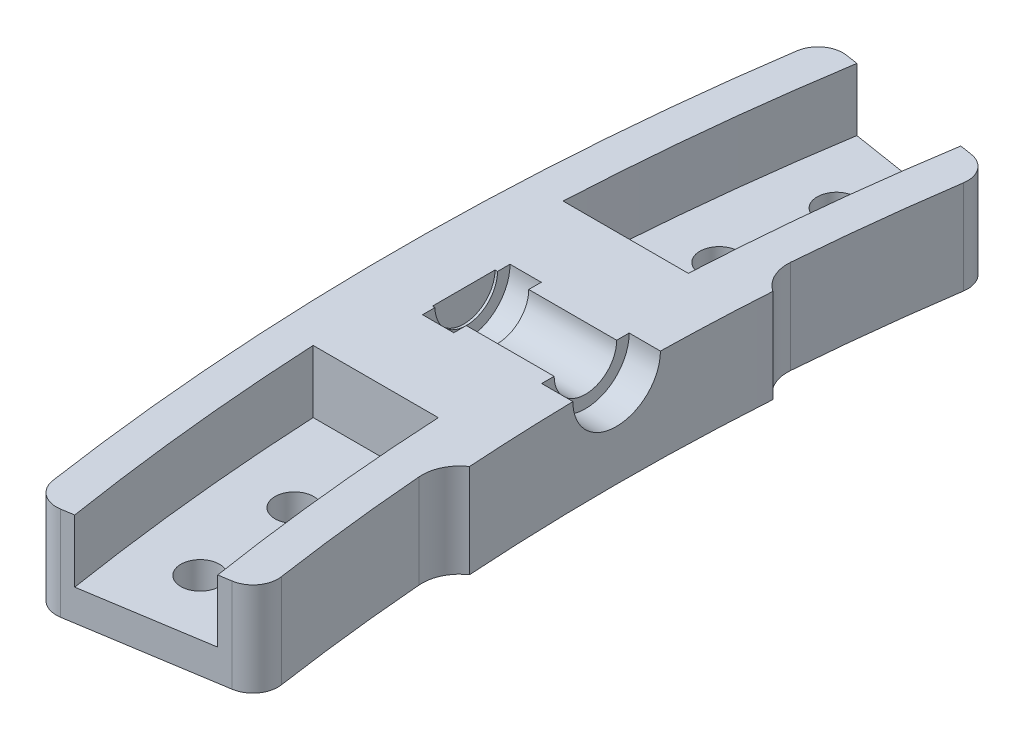
ISO-10303-21;
HEADER;
FILE_DESCRIPTION(('STEP AP214'),'2;1');
FILE_NAME('part.step','',(''),(''),'','','');
FILE_SCHEMA(('AUTOMOTIVE_DESIGN { 1 0 10303 214 1 1 1 1 }'));
ENDSEC;
DATA;
#1=APPLICATION_CONTEXT('core data for automotive mechanical design processes');
#2=APPLICATION_PROTOCOL_DEFINITION('international standard','automotive_design',2000,#1);
#3=PRODUCT_CONTEXT('',#1,'mechanical');
#4=PRODUCT('Part','Part','',(#3));
#5=PRODUCT_RELATED_PRODUCT_CATEGORY('part','',(#4));
#6=PRODUCT_DEFINITION_FORMATION('','',#4);
#7=PRODUCT_DEFINITION_CONTEXT('part definition',#1,'design');
#8=PRODUCT_DEFINITION('design','',#6,#7);
#9=PRODUCT_DEFINITION_SHAPE('','',#8);
#10=(LENGTH_UNIT() NAMED_UNIT(*) SI_UNIT(.MILLI.,.METRE.));
#11=(NAMED_UNIT(*) PLANE_ANGLE_UNIT() SI_UNIT($,.RADIAN.));
#12=(NAMED_UNIT(*) SI_UNIT($,.STERADIAN.) SOLID_ANGLE_UNIT());
#13=UNCERTAINTY_MEASURE_WITH_UNIT(LENGTH_MEASURE(1.E-05),#10,'distance_accuracy_value','');
#14=(GEOMETRIC_REPRESENTATION_CONTEXT(3) GLOBAL_UNCERTAINTY_ASSIGNED_CONTEXT((#13)) GLOBAL_UNIT_ASSIGNED_CONTEXT((#10,
#11,#12)) REPRESENTATION_CONTEXT('',''));
#15=CARTESIAN_POINT('',(0.,0.,0.));
#16=DIRECTION('',(0.,0.,1.));
#17=DIRECTION('',(1.,0.,0.));
#18=AXIS2_PLACEMENT_3D('',#15,#16,#17);
#19=CARTESIAN_POINT('',(0.,10.,0.));
#20=DIRECTION('',(0.,-1.,0.));
#21=DIRECTION('',(0.,0.,-1.));
#22=AXIS2_PLACEMENT_3D('',#19,#20,#21);
#23=CYLINDRICAL_SURFACE('',#22,185.5);
#24=CARTESIAN_POINT('',(0.,2.5,0.));
#25=DIRECTION('',(0.,1.,0.));
#26=DIRECTION('',(0.,0.,-1.));
#27=AXIS2_PLACEMENT_3D('',#24,#25,#26);
#28=CIRCLE('',#27,185.5);
#29=CARTESIAN_POINT('',(-185.102830260761,2.5,-12.1322804721913));
#30=VERTEX_POINT('',#29);
#31=CARTESIAN_POINT('',(-185.102830260761,2.5,12.1322804721918));
#32=VERTEX_POINT('',#31);
#33=EDGE_CURVE('E343',#30,#32,#28,.T.);
#34=ORIENTED_EDGE('',*,*,#33,.F.);
#35=DIRECTION('',(0.,-1.,0.));
#36=VECTOR('',#35,1.);
#37=CARTESIAN_POINT('',(-185.102830260761,10.,-12.1322804721916));
#38=LINE('',#37,#36);
#39=CARTESIAN_POINT('',(-185.102830260761,10.,-12.1322804721916));
#40=VERTEX_POINT('',#39);
#41=EDGE_CURVE('E346',#40,#30,#38,.T.);
#42=ORIENTED_EDGE('',*,*,#41,.F.);
#43=CARTESIAN_POINT('',(0.,10.,0.));
#44=DIRECTION('',(0.,-1.,0.));
#45=DIRECTION('',(0.,0.,1.));
#46=AXIS2_PLACEMENT_3D('',#43,#44,#45);
#47=CIRCLE('',#46,185.5);
#48=CARTESIAN_POINT('',(-185.466978192885,10.,-3.50000000000007));
#49=VERTEX_POINT('',#48);
#50=EDGE_CURVE('E456',#49,#40,#47,.T.);
#51=ORIENTED_EDGE('',*,*,#50,.F.);
#52=CARTESIAN_POINT('',(-185.466978192885,10.,-3.5));
#53=CARTESIAN_POINT('',(-185.466977430939,9.9015687384195,-3.50000944061988));
#54=CARTESIAN_POINT('',(-185.467056536335,9.80314196188526,-3.49584772852682));
#55=CARTESIAN_POINT('',(-185.467368855888,9.60699276190361,-3.47925506337131));
#56=CARTESIAN_POINT('',(-185.467602062565,9.50927030450143,-3.46682451167632));
#57=CARTESIAN_POINT('',(-185.468216741485,9.31528432602201,-3.43377895386925));
#58=CARTESIAN_POINT('',(-185.468598108343,9.21901981836458,-3.4131697649693));
#59=CARTESIAN_POINT('',(-185.469497617825,9.0285929662776,-3.36393426603975));
#60=CARTESIAN_POINT('',(-185.470015758806,8.93443059661094,-3.33530805231413));
#61=CARTESIAN_POINT('',(-185.471755316775,8.65600881932056,-3.23763660090778));
#62=CARTESIAN_POINT('',(-185.473162149319,8.47573195361423,-3.1567843740943));
#63=CARTESIAN_POINT('',(-185.476310472255,8.13144657686859,-2.96602237242094));
#64=CARTESIAN_POINT('',(-185.478051897782,7.96743492200356,-2.85611822798098));
#65=CARTESIAN_POINT('',(-185.481673830463,7.66013870584939,-2.61031457726576));
#66=CARTESIAN_POINT('',(-185.483554356072,7.51685690237821,-2.47441161778506));
#67=CARTESIAN_POINT('',(-185.487242545187,7.25512688017052,-2.180461789051));
#68=CARTESIAN_POINT('',(-185.489050197554,7.13668244637191,-2.02241155091273));
#69=CARTESIAN_POINT('',(-185.492388616318,6.92800421618844,-1.6886604756404));
#70=CARTESIAN_POINT('',(-185.493919374273,6.83777127989766,-1.51295910058552));
#71=CARTESIAN_POINT('',(-185.496531252063,6.68809125509204,-1.14890943189334));
#72=CARTESIAN_POINT('',(-185.497612400989,6.62864217475323,-0.960561957394306));
#73=CARTESIAN_POINT('',(-185.499203226703,6.54221396354896,-0.576576330685134));
#74=CARTESIAN_POINT('',(-185.499712960763,6.51523157863381,-0.380938911153297));
#75=CARTESIAN_POINT('',(-185.500103688222,6.4944927772822,0.0120942016270402));
#76=CARTESIAN_POINT('',(-185.499984667711,6.50073709590742,0.20948993367757));
#77=CARTESIAN_POINT('',(-185.499131332768,6.5462726740005,0.600403183315228));
#78=CARTESIAN_POINT('',(-185.498397102807,6.58555939657909,0.793921229593688));
#79=CARTESIAN_POINT('',(-185.4963962187,6.6960574896132,1.17161389756717));
#80=CARTESIAN_POINT('',(-185.495129566015,6.76726877236853,1.35578854492795));
#81=CARTESIAN_POINT('',(-185.492206448889,6.93960136811132,1.70958526125013));
#82=CARTESIAN_POINT('',(-185.490549949042,7.04072539785485,1.87920600658106));
#83=CARTESIAN_POINT('',(-185.487033980167,7.2700059386379,2.19905613244696));
#84=CARTESIAN_POINT('',(-185.485174520891,7.39816115100553,2.34928644400698));
#85=CARTESIAN_POINT('',(-185.481462067495,7.67787076446034,2.62610683719885));
#86=CARTESIAN_POINT('',(-185.479609073517,7.82942567372653,2.75269640528484));
#87=CARTESIAN_POINT('',(-185.476117893751,8.15169764500472,2.97867604968191));
#88=CARTESIAN_POINT('',(-185.474479776318,8.322420772798,3.0780574815778));
#89=CARTESIAN_POINT('',(-185.471602891485,8.67820485888656,3.24679456806401));
#90=CARTESIAN_POINT('',(-185.470364368728,8.86327451485222,3.31613183768987));
#91=CARTESIAN_POINT('',(-185.468429637325,9.24228661070111,3.42264413776416));
#92=CARTESIAN_POINT('',(-185.46773260079,9.43621502360442,3.45986827637521));
#93=CARTESIAN_POINT('',(-185.467222256108,9.69286188419213,3.48704466585143));
#94=CARTESIAN_POINT('',(-185.467130779183,9.75424289207597,3.49190547814544));
#95=CARTESIAN_POINT('',(-185.467008829149,9.87707430779331,3.49837871080356));
#96=CARTESIAN_POINT('',(-185.466978255392,9.93852443293174,3.49999649055055));
#97=CARTESIAN_POINT('',(-185.466978192885,10.,3.49999999999996));
#98=B_SPLINE_CURVE_WITH_KNOTS('',3,(#52,#53,#54,#55,#56,#57,#58,#59,#60,#61,#62,#63,#64,#65,#66,
#67,#68,#69,#70,#71,#72,#73,#74,#75,#76,#77,#78,#79,#80,#81,#82,#83,#84,#85,#86,#87,#88,#89,#90,
#91,#92,#93,#94,#95,#96,#97),.UNSPECIFIED.,.F.,.F.,(4,2,2,2,2,2,2,2,2,2,2,2,2,2,2,2,2,2,2,2,2,2,
4),(0.,0.295197718043893,0.590381108307979,0.885354918967884,1.18032518642623,1.77001690874314,
2.35959442927562,2.94925031290328,3.53899598831038,4.12875964175319,4.71848513063971,
5.30815150799942,5.89783093037718,6.48742940000166,7.07702624994617,7.66667666511138,
8.25629875787275,8.84593365745519,9.43575567567408,10.025938116493,10.6152164283205,
10.7998763838495,10.9842309209288),.UNSPECIFIED.);
#99=CARTESIAN_POINT('',(-185.466978192885,10.,3.50000000000145));
#100=VERTEX_POINT('',#99);
#101=EDGE_CURVE('E42',#49,#100,#98,.T.);
#102=ORIENTED_EDGE('',*,*,#101,.T.);
#103=CARTESIAN_POINT('',(-185.102830260761,10.,12.1322804721917));
#104=VERTEX_POINT('',#103);
#105=EDGE_CURVE('E366',#104,#100,#47,.T.);
#106=ORIENTED_EDGE('',*,*,#105,.F.);
#107=DIRECTION('',(0.,-1.,0.));
#108=VECTOR('',#107,1.);
#109=CARTESIAN_POINT('',(-185.102830260761,10.,12.1322804721917));
#110=LINE('',#109,#108);
#111=EDGE_CURVE('E350',#104,#32,#110,.T.);
#112=ORIENTED_EDGE('',*,*,#111,.T.);
#113=EDGE_LOOP('',(#34,#42,#51,#102,#106,#112));
#114=FACE_BOUND('',#113,.T.);
#115=ADVANCED_FACE('F34',(#114),#23,.F.);
#116=CARTESIAN_POINT('',(0.,10.,0.));
#117=DIRECTION('',(0.,-1.,0.));
#118=DIRECTION('',(0.,0.,-1.));
#119=AXIS2_PLACEMENT_3D('',#116,#117,#118);
#120=CYLINDRICAL_SURFACE('',#119,187.);
#121=DIRECTION('',(0.,-1.,0.));
#122=VECTOR('',#121,1.);
#123=CARTESIAN_POINT('',(-186.409178624213,10.,-14.8532193361004));
#124=LINE('',#123,#122);
#125=CARTESIAN_POINT('',(-186.409178624213,10.,-14.8532193361004));
#126=VERTEX_POINT('',#125);
#127=CARTESIAN_POINT('',(-186.409178624213,2.5,-14.8532193361002));
#128=VERTEX_POINT('',#127);
#129=EDGE_CURVE('E445',#126,#128,#124,.T.);
#130=ORIENTED_EDGE('',*,*,#129,.T.);
#131=CARTESIAN_POINT('',(0.,2.5,0.));
#132=DIRECTION('',(0.,1.,0.));
#133=DIRECTION('',(0.,0.,-1.));
#134=AXIS2_PLACEMENT_3D('',#131,#132,#133);
#135=CIRCLE('',#134,187.);
#136=CARTESIAN_POINT('',(-184.996936421358,2.5,-27.2971338186249));
#137=VERTEX_POINT('',#136);
#138=EDGE_CURVE('E458',#137,#128,#135,.T.);
#139=ORIENTED_EDGE('',*,*,#138,.F.);
#140=DIRECTION('',(0.,-1.,0.));
#141=VECTOR('',#140,1.);
#142=CARTESIAN_POINT('',(-184.996936421358,10.,-27.2971338186249));
#143=LINE('',#142,#141);
#144=CARTESIAN_POINT('',(-184.996936421358,10.,-27.2971338186249));
#145=VERTEX_POINT('',#144);
#146=EDGE_CURVE('E269',#137,#145,#143,.F.);
#147=ORIENTED_EDGE('',*,*,#146,.T.);
#148=CARTESIAN_POINT('',(0.,10.,0.));
#149=DIRECTION('',(0.,1.,0.));
#150=DIRECTION('',(0.,0.,1.));
#151=AXIS2_PLACEMENT_3D('',#148,#149,#150);
#152=CIRCLE('',#151,187.);
#153=EDGE_CURVE('E438',#145,#126,#152,.T.);
#154=ORIENTED_EDGE('',*,*,#153,.T.);
#155=EDGE_LOOP('',(#130,#139,#147,#154));
#156=FACE_BOUND('',#155,.T.);
#157=ADVANCED_FACE('F332',(#156),#120,.F.);
#158=DIRECTION('',(0.,-1.,0.));
#159=VECTOR('',#158,1.);
#160=CARTESIAN_POINT('',(-184.996936421358,10.,27.2971338186247));
#161=LINE('',#160,#159);
#162=CARTESIAN_POINT('',(-184.996936421358,10.,27.2971338186247));
#163=VERTEX_POINT('',#162);
#164=CARTESIAN_POINT('',(-184.996936421358,2.5,27.2971338186247));
#165=VERTEX_POINT('',#164);
#166=EDGE_CURVE('E266',#163,#165,#161,.T.);
#167=ORIENTED_EDGE('',*,*,#166,.T.);
#168=CARTESIAN_POINT('',(0.,2.5,0.));
#169=DIRECTION('',(0.,1.,0.));
#170=DIRECTION('',(0.,0.,-1.));
#171=AXIS2_PLACEMENT_3D('',#168,#169,#170);
#172=CIRCLE('',#171,187.);
#173=CARTESIAN_POINT('',(-186.409178624213,2.5,14.8532193361011));
#174=VERTEX_POINT('',#173);
#175=EDGE_CURVE('E493',#174,#165,#172,.T.);
#176=ORIENTED_EDGE('',*,*,#175,.F.);
#177=DIRECTION('',(0.,-1.,0.));
#178=VECTOR('',#177,1.);
#179=CARTESIAN_POINT('',(-186.409178624213,10.,14.8532193361011));
#180=LINE('',#179,#178);
#181=CARTESIAN_POINT('',(-186.409178624213,10.,14.8532193361011));
#182=VERTEX_POINT('',#181);
#183=EDGE_CURVE('E449',#174,#182,#180,.F.);
#184=ORIENTED_EDGE('',*,*,#183,.T.);
#185=EDGE_CURVE('E437',#182,#163,#152,.T.);
#186=ORIENTED_EDGE('',*,*,#185,.T.);
#187=EDGE_LOOP('',(#167,#176,#184,#186));
#188=FACE_BOUND('',#187,.T.);
#189=ADVANCED_FACE('F337',(#188),#120,.F.);
#190=CARTESIAN_POINT('',(0.,10.,0.));
#191=DIRECTION('',(0.156434465040231,0.,0.987688340595138));
#192=DIRECTION('',(0.987688340595138,0.,-0.156434465040231));
#193=AXIS2_PLACEMENT_3D('',#190,#191,#192);
#194=PLANE('',#193);
#195=DIRECTION('',(0.,1.,0.));
#196=VECTOR('',#195,1.);
#197=CARTESIAN_POINT('',(-198.515528471673,0.,31.4417708727156));
#198=LINE('',#197,#196);
#199=CARTESIAN_POINT('',(-198.515528471673,10.,31.4417708727156));
#200=VERTEX_POINT('',#199);
#201=CARTESIAN_POINT('',(-198.515528471673,2.5,31.4417708727156));
#202=VERTEX_POINT('',#201);
#203=EDGE_CURVE('E264',#200,#202,#198,.F.);
#204=ORIENTED_EDGE('',*,*,#203,.T.);
#205=DIRECTION('',(-0.987688340595138,0.,0.156434465040229));
#206=VECTOR('',#205,1.);
#207=CARTESIAN_POINT('',(-186.662644351399,2.5,29.5644584550945));
#208=LINE('',#207,#206);
#209=CARTESIAN_POINT('',(-186.662644351399,2.5,29.5644584550945));
#210=VERTEX_POINT('',#209);
#211=EDGE_CURVE('E224',#210,#202,#208,.T.);
#212=ORIENTED_EDGE('',*,*,#211,.F.);
#213=DIRECTION('',(0.,-1.,0.));
#214=VECTOR('',#213,1.);
#215=CARTESIAN_POINT('',(-186.662644351399,10.,29.5644584550944));
#216=LINE('',#215,#214);
#217=CARTESIAN_POINT('',(-186.662644351399,10.,29.5644584550944));
#218=VERTEX_POINT('',#217);
#219=EDGE_CURVE('E262',#210,#218,#216,.F.);
#220=ORIENTED_EDGE('',*,*,#219,.T.);
#221=DIRECTION('',(-0.987688340595138,0.,0.156434465040231));
#222=VECTOR('',#221,1.);
#223=CARTESIAN_POINT('',(0.,10.,0.));
#224=LINE('',#223,#222);
#225=CARTESIAN_POINT('',(-187.660784713076,10.,29.7225483576439));
#226=VERTEX_POINT('',#225);
#227=EDGE_CURVE('E435',#218,#226,#224,.T.);
#228=ORIENTED_EDGE('',*,*,#227,.T.);
#229=DIRECTION('',(0.,1.,0.));
#230=VECTOR('',#229,1.);
#231=CARTESIAN_POINT('',(-187.660784713076,5.,29.7225483576439));
#232=LINE('',#231,#230);
#233=CARTESIAN_POINT('',(-187.660784713076,5.,29.7225483576439));
#234=VERTEX_POINT('',#233);
#235=EDGE_CURVE('E427',#234,#226,#232,.T.);
#236=ORIENTED_EDGE('',*,*,#235,.F.);
#237=DIRECTION('',(0.987688340595138,0.,-0.156434465040231));
#238=VECTOR('',#237,1.);
#239=CARTESIAN_POINT('',(0.,5.,0.));
#240=LINE('',#239,#238);
#241=CARTESIAN_POINT('',(-197.537668119028,5.,31.2868930080463));
#242=VERTEX_POINT('',#241);
#243=EDGE_CURVE('E415',#242,#234,#240,.T.);
#244=ORIENTED_EDGE('',*,*,#243,.F.);
#245=DIRECTION('',(0.,1.,0.));
#246=VECTOR('',#245,1.);
#247=CARTESIAN_POINT('',(-197.537668119028,5.,31.2868930080463));
#248=LINE('',#247,#246);
#249=CARTESIAN_POINT('',(-197.537668119028,10.,31.2868930080463));
#250=VERTEX_POINT('',#249);
#251=EDGE_CURVE('E430',#242,#250,#248,.T.);
#252=ORIENTED_EDGE('',*,*,#251,.T.);
#253=EDGE_CURVE('E401',#250,#200,#224,.T.);
#254=ORIENTED_EDGE('',*,*,#253,.T.);
#255=EDGE_LOOP('',(#204,#212,#220,#228,#236,#244,#252,#254));
#256=FACE_BOUND('',#255,.T.);
#257=ADVANCED_FACE('F564',(#256),#194,.T.);
#258=CARTESIAN_POINT('',(0.,10.,0.));
#259=DIRECTION('',(0.156434465040232,0.,-0.987688340595138));
#260=DIRECTION('',(-0.987688340595138,0.,-0.156434465040232));
#261=AXIS2_PLACEMENT_3D('',#258,#259,#260);
#262=PLANE('',#261);
#263=DIRECTION('',(0.,-1.,0.));
#264=VECTOR('',#263,1.);
#265=CARTESIAN_POINT('',(-186.662644351399,10.,-29.5644584550946));
#266=LINE('',#265,#264);
#267=CARTESIAN_POINT('',(-186.662644351399,10.,-29.5644584550946));
#268=VERTEX_POINT('',#267);
#269=CARTESIAN_POINT('',(-186.662644351399,2.5,-29.5644584550946));
#270=VERTEX_POINT('',#269);
#271=EDGE_CURVE('E245',#268,#270,#266,.T.);
#272=ORIENTED_EDGE('',*,*,#271,.T.);
#273=DIRECTION('',(0.987688340595138,0.,0.156434465040231));
#274=VECTOR('',#273,1.);
#275=CARTESIAN_POINT('',(-198.515528471673,2.5,-31.4417708727157));
#276=LINE('',#275,#274);
#277=CARTESIAN_POINT('',(-198.515528471673,2.5,-31.4417708727157));
#278=VERTEX_POINT('',#277);
#279=EDGE_CURVE('E49',#278,#270,#276,.T.);
#280=ORIENTED_EDGE('',*,*,#279,.F.);
#281=DIRECTION('',(0.,1.,0.));
#282=VECTOR('',#281,1.);
#283=CARTESIAN_POINT('',(-198.515528471673,10.,-31.4417708727157));
#284=LINE('',#283,#282);
#285=CARTESIAN_POINT('',(-198.515528471673,10.,-31.4417708727157));
#286=VERTEX_POINT('',#285);
#287=EDGE_CURVE('E253',#278,#286,#284,.T.);
#288=ORIENTED_EDGE('',*,*,#287,.T.);
#289=DIRECTION('',(0.987688340595138,0.,0.156434465040232));
#290=VECTOR('',#289,1.);
#291=CARTESIAN_POINT('',(0.,10.,0.));
#292=LINE('',#291,#290);
#293=CARTESIAN_POINT('',(-197.537668119028,10.,-31.2868930080464));
#294=VERTEX_POINT('',#293);
#295=EDGE_CURVE('E441',#286,#294,#292,.T.);
#296=ORIENTED_EDGE('',*,*,#295,.T.);
#297=DIRECTION('',(0.,1.,0.));
#298=VECTOR('',#297,1.);
#299=CARTESIAN_POINT('',(-197.537668119028,5.,-31.2868930080464));
#300=LINE('',#299,#298);
#301=CARTESIAN_POINT('',(-197.537668119028,5.,-31.2868930080464));
#302=VERTEX_POINT('',#301);
#303=EDGE_CURVE('E388',#302,#294,#300,.T.);
#304=ORIENTED_EDGE('',*,*,#303,.F.);
#305=DIRECTION('',(-0.987688340595138,0.,-0.156434465040232));
#306=VECTOR('',#305,1.);
#307=CARTESIAN_POINT('',(0.,5.,0.));
#308=LINE('',#307,#306);
#309=CARTESIAN_POINT('',(-187.660784713076,5.,-29.7225483576441));
#310=VERTEX_POINT('',#309);
#311=EDGE_CURVE('E377',#310,#302,#308,.T.);
#312=ORIENTED_EDGE('',*,*,#311,.F.);
#313=DIRECTION('',(0.,1.,0.));
#314=VECTOR('',#313,1.);
#315=CARTESIAN_POINT('',(-187.660784713076,5.,-29.7225483576441));
#316=LINE('',#315,#314);
#317=CARTESIAN_POINT('',(-187.660784713076,10.,-29.7225483576441));
#318=VERTEX_POINT('',#317);
#319=EDGE_CURVE('E398',#310,#318,#316,.T.);
#320=ORIENTED_EDGE('',*,*,#319,.T.);
#321=EDGE_CURVE('E440',#318,#268,#292,.T.);
#322=ORIENTED_EDGE('',*,*,#321,.T.);
#323=EDGE_LOOP('',(#272,#280,#288,#296,#304,#312,#320,#322));
#324=FACE_BOUND('',#323,.T.);
#325=ADVANCED_FACE('F466',(#324),#262,.T.);
#326=CARTESIAN_POINT('',(0.,10.,0.));
#327=DIRECTION('',(0.,-1.,0.));
#328=DIRECTION('',(0.,0.,-1.));
#329=AXIS2_PLACEMENT_3D('',#326,#327,#328);
#330=CYLINDRICAL_SURFACE('',#329,203.);
#331=CARTESIAN_POINT('',(0.,2.5,0.));
#332=DIRECTION('',(0.,-1.,0.));
#333=DIRECTION('',(0.,0.,-1.));
#334=AXIS2_PLACEMENT_3D('',#331,#332,#333);
#335=CIRCLE('',#334,203.);
#336=CARTESIAN_POINT('',(-200.806789415701,2.5,29.7595921436799));
#337=VERTEX_POINT('',#336);
#338=CARTESIAN_POINT('',(-200.806789415701,2.5,-29.7595921436798));
#339=VERTEX_POINT('',#338);
#340=EDGE_CURVE('E221',#337,#339,#335,.T.);
#341=ORIENTED_EDGE('',*,*,#340,.F.);
#342=DIRECTION('',(0.,-1.,0.));
#343=VECTOR('',#342,1.);
#344=CARTESIAN_POINT('',(-200.806789415701,10.,29.7595921436798));
#345=LINE('',#344,#343);
#346=CARTESIAN_POINT('',(-200.806789415701,10.,29.7595921436798));
#347=VERTEX_POINT('',#346);
#348=EDGE_CURVE('E234',#337,#347,#345,.F.);
#349=ORIENTED_EDGE('',*,*,#348,.T.);
#350=CARTESIAN_POINT('',(0.,10.,0.));
#351=DIRECTION('',(0.,1.,0.));
#352=DIRECTION('',(0.,0.,1.));
#353=AXIS2_PLACEMENT_3D('',#350,#351,#352);
#354=CIRCLE('',#353,203.);
#355=CARTESIAN_POINT('',(-200.806789415701,10.,-29.7595921436799));
#356=VERTEX_POINT('',#355);
#357=EDGE_CURVE('E443',#356,#347,#354,.T.);
#358=ORIENTED_EDGE('',*,*,#357,.F.);
#359=DIRECTION('',(0.,-1.,0.));
#360=VECTOR('',#359,1.);
#361=CARTESIAN_POINT('',(-200.806789415701,10.,-29.7595921436799));
#362=LINE('',#361,#360);
#363=EDGE_CURVE('E237',#356,#339,#362,.T.);
#364=ORIENTED_EDGE('',*,*,#363,.T.);
#365=EDGE_LOOP('',(#341,#349,#358,#364));
#366=FACE_BOUND('',#365,.T.);
#367=ADVANCED_FACE('F232',(#366),#330,.T.);
#368=CARTESIAN_POINT('',(-193.331747967893,0.,-25.4526074829103));
#369=DIRECTION('',(0.,-1.,0.));
#370=DIRECTION('',(0.,0.,-1.));
#371=AXIS2_PLACEMENT_3D('',#368,#369,#370);
#372=CYLINDRICAL_SURFACE('',#371,1.55);
#373=CARTESIAN_POINT('',(-193.331747967893,5.,-25.4526074829103));
#374=DIRECTION('',(0.,1.,0.));
#375=DIRECTION('',(0.,0.,1.));
#376=AXIS2_PLACEMENT_3D('',#373,#374,#375);
#377=CIRCLE('',#376,1.55);
#378=CARTESIAN_POINT('',(-193.331747967893,5.,-23.9026074829103));
#379=VERTEX_POINT('',#378);
#380=EDGE_CURVE('E373',#379,#379,#377,.T.);
#381=ORIENTED_EDGE('',*,*,#380,.T.);
#382=EDGE_LOOP('',(#381));
#383=FACE_BOUND('',#382,.T.);
#384=CARTESIAN_POINT('',(-193.331747967893,2.5,-25.4526074829103));
#385=DIRECTION('',(0.,-1.,0.));
#386=DIRECTION('',(0.,0.,-1.));
#387=AXIS2_PLACEMENT_3D('',#384,#385,#386);
#388=CIRCLE('',#387,1.55);
#389=CARTESIAN_POINT('',(-193.331747967893,2.5,-27.0026074829102));
#390=VERTEX_POINT('',#389);
#391=EDGE_CURVE('E507',#390,#390,#388,.F.);
#392=ORIENTED_EDGE('',*,*,#391,.F.);
#393=EDGE_LOOP('',(#392));
#394=FACE_BOUND('',#393,.T.);
#395=ADVANCED_FACE('F606',(#383,#394),#372,.F.);
#396=CARTESIAN_POINT('',(-194.25796612789,0.,-16.9953698357934));
#397=DIRECTION('',(0.,-1.,0.));
#398=DIRECTION('',(0.,0.,-1.));
#399=AXIS2_PLACEMENT_3D('',#396,#397,#398);
#400=CYLINDRICAL_SURFACE('',#399,1.55);
#401=CARTESIAN_POINT('',(-194.25796612789,5.,-16.9953698357934));
#402=DIRECTION('',(0.,1.,0.));
#403=DIRECTION('',(0.,0.,1.));
#404=AXIS2_PLACEMENT_3D('',#401,#402,#403);
#405=CIRCLE('',#404,1.55);
#406=CARTESIAN_POINT('',(-194.25796612789,5.,-15.4453698357934));
#407=VERTEX_POINT('',#406);
#408=EDGE_CURVE('E372',#407,#407,#405,.T.);
#409=ORIENTED_EDGE('',*,*,#408,.T.);
#410=EDGE_LOOP('',(#409));
#411=FACE_BOUND('',#410,.T.);
#412=CARTESIAN_POINT('',(-194.25796612789,2.5,-16.9953698357934));
#413=DIRECTION('',(0.,-1.,0.));
#414=DIRECTION('',(0.,0.,-1.));
#415=AXIS2_PLACEMENT_3D('',#412,#413,#414);
#416=CIRCLE('',#415,1.55);
#417=CARTESIAN_POINT('',(-194.25796612789,2.5,-18.5453698357934));
#418=VERTEX_POINT('',#417);
#419=EDGE_CURVE('E504',#418,#418,#416,.F.);
#420=ORIENTED_EDGE('',*,*,#419,.F.);
#421=EDGE_LOOP('',(#420));
#422=FACE_BOUND('',#421,.T.);
#423=ADVANCED_FACE('F768',(#411,#422),#400,.F.);
#424=CARTESIAN_POINT('',(-194.25796612789,0.,16.9953698357934));
#425=DIRECTION('',(0.,-1.,0.));
#426=DIRECTION('',(0.,0.,-1.));
#427=AXIS2_PLACEMENT_3D('',#424,#425,#426);
#428=CYLINDRICAL_SURFACE('',#427,1.55);
#429=CARTESIAN_POINT('',(-194.25796612789,5.,16.9953698357934));
#430=DIRECTION('',(0.,1.,0.));
#431=DIRECTION('',(0.,0.,1.));
#432=AXIS2_PLACEMENT_3D('',#429,#430,#431);
#433=CIRCLE('',#432,1.55);
#434=CARTESIAN_POINT('',(-194.25796612789,5.,18.5453698357934));
#435=VERTEX_POINT('',#434);
#436=EDGE_CURVE('E364',#435,#435,#433,.T.);
#437=ORIENTED_EDGE('',*,*,#436,.T.);
#438=EDGE_LOOP('',(#437));
#439=FACE_BOUND('',#438,.T.);
#440=CARTESIAN_POINT('',(-194.25796612789,2.5,16.9953698357934));
#441=DIRECTION('',(0.,-1.,0.));
#442=DIRECTION('',(0.,0.,-1.));
#443=AXIS2_PLACEMENT_3D('',#440,#441,#442);
#444=CIRCLE('',#443,1.55);
#445=CARTESIAN_POINT('',(-194.25796612789,2.5,15.4453698357934));
#446=VERTEX_POINT('',#445);
#447=EDGE_CURVE('E501',#446,#446,#444,.F.);
#448=ORIENTED_EDGE('',*,*,#447,.F.);
#449=EDGE_LOOP('',(#448));
#450=FACE_BOUND('',#449,.T.);
#451=ADVANCED_FACE('F778',(#439,#450),#428,.F.);
#452=CARTESIAN_POINT('',(-193.331747967893,0.,25.4526074829103));
#453=DIRECTION('',(0.,-1.,0.));
#454=DIRECTION('',(0.,0.,-1.));
#455=AXIS2_PLACEMENT_3D('',#452,#453,#454);
#456=CYLINDRICAL_SURFACE('',#455,1.55);
#457=CARTESIAN_POINT('',(-193.331747967893,5.,25.4526074829103));
#458=DIRECTION('',(0.,1.,0.));
#459=DIRECTION('',(0.,0.,1.));
#460=AXIS2_PLACEMENT_3D('',#457,#458,#459);
#461=CIRCLE('',#460,1.55);
#462=CARTESIAN_POINT('',(-193.331747967893,5.,27.0026074829102));
#463=VERTEX_POINT('',#462);
#464=EDGE_CURVE('E361',#463,#463,#461,.T.);
#465=ORIENTED_EDGE('',*,*,#464,.T.);
#466=EDGE_LOOP('',(#465));
#467=FACE_BOUND('',#466,.T.);
#468=CARTESIAN_POINT('',(-193.331747967893,2.5,25.4526074829103));
#469=DIRECTION('',(0.,-1.,0.));
#470=DIRECTION('',(0.,0.,-1.));
#471=AXIS2_PLACEMENT_3D('',#468,#469,#470);
#472=CIRCLE('',#471,1.55);
#473=CARTESIAN_POINT('',(-193.331747967893,2.5,23.9026074829103));
#474=VERTEX_POINT('',#473);
#475=EDGE_CURVE('E498',#474,#474,#472,.F.);
#476=ORIENTED_EDGE('',*,*,#475,.F.);
#477=EDGE_LOOP('',(#476));
#478=FACE_BOUND('',#477,.T.);
#479=ADVANCED_FACE('F613',(#467,#478),#456,.F.);
#480=CARTESIAN_POINT('',(-183.418657042006,10.,-14.6149323948795));
#481=DIRECTION('',(0.,-1.,0.));
#482=DIRECTION('',(0.,0.,-1.));
#483=AXIS2_PLACEMENT_3D('',#480,#481,#482);
#484=CYLINDRICAL_SURFACE('',#483,3.);
#485=CARTESIAN_POINT('',(-183.418657042006,2.5,-14.6149323948795));
#486=DIRECTION('',(0.,1.,0.));
#487=DIRECTION('',(0.,0.,-1.));
#488=AXIS2_PLACEMENT_3D('',#485,#486,#487);
#489=CIRCLE('',#488,2.99999999999987);
#490=EDGE_CURVE('E353',#128,#30,#489,.T.);
#491=ORIENTED_EDGE('',*,*,#490,.F.);
#492=ORIENTED_EDGE('',*,*,#129,.F.);
#493=CARTESIAN_POINT('',(-183.418657042006,10.,-14.6149323948795));
#494=DIRECTION('',(0.,1.,0.));
#495=DIRECTION('',(0.,0.,1.));
#496=AXIS2_PLACEMENT_3D('',#493,#494,#495);
#497=CIRCLE('',#496,3.);
#498=EDGE_CURVE('E247',#40,#126,#497,.F.);
#499=ORIENTED_EDGE('',*,*,#498,.F.);
#500=ORIENTED_EDGE('',*,*,#41,.T.);
#501=EDGE_LOOP('',(#491,#492,#499,#500));
#502=FACE_BOUND('',#501,.T.);
#503=ADVANCED_FACE('F357',(#502),#484,.F.);
#504=CARTESIAN_POINT('',(-183.418657042006,10.,14.6149323948802));
#505=DIRECTION('',(0.,-1.,0.));
#506=DIRECTION('',(0.,0.,-1.));
#507=AXIS2_PLACEMENT_3D('',#504,#505,#506);
#508=CYLINDRICAL_SURFACE('',#507,3.);
#509=CARTESIAN_POINT('',(-183.418657042006,2.5,14.6149323948802));
#510=DIRECTION('',(0.,1.,0.));
#511=DIRECTION('',(0.,0.,-1.));
#512=AXIS2_PLACEMENT_3D('',#509,#510,#511);
#513=CIRCLE('',#512,2.99999999999997);
#514=EDGE_CURVE('E352',#32,#174,#513,.T.);
#515=ORIENTED_EDGE('',*,*,#514,.F.);
#516=ORIENTED_EDGE('',*,*,#111,.F.);
#517=CARTESIAN_POINT('',(-183.418657042006,10.,14.6149323948802));
#518=DIRECTION('',(0.,1.,0.));
#519=DIRECTION('',(0.,0.,1.));
#520=AXIS2_PLACEMENT_3D('',#517,#518,#519);
#521=CIRCLE('',#520,3.);
#522=EDGE_CURVE('E243',#182,#104,#521,.F.);
#523=ORIENTED_EDGE('',*,*,#522,.F.);
#524=ORIENTED_EDGE('',*,*,#183,.F.);
#525=EDGE_LOOP('',(#515,#516,#523,#524));
#526=FACE_BOUND('',#525,.T.);
#527=ADVANCED_FACE('F551',(#526),#508,.F.);
#528=CARTESIAN_POINT('',(-198.828397401754,10.,-29.4663941915254));
#529=DIRECTION('',(0.,-1.,0.));
#530=DIRECTION('',(0.,0.,-1.));
#531=AXIS2_PLACEMENT_3D('',#528,#529,#530);
#532=CYLINDRICAL_SURFACE('',#531,2.);
#533=ORIENTED_EDGE('',*,*,#287,.F.);
#534=CARTESIAN_POINT('',(-198.828397401754,2.5,-29.4663941915254));
#535=DIRECTION('',(0.,-1.,0.));
#536=DIRECTION('',(0.,0.,-1.));
#537=AXIS2_PLACEMENT_3D('',#534,#535,#536);
#538=CIRCLE('',#537,2.);
#539=EDGE_CURVE('E238',#339,#278,#538,.T.);
#540=ORIENTED_EDGE('',*,*,#539,.F.);
#541=ORIENTED_EDGE('',*,*,#363,.F.);
#542=CARTESIAN_POINT('',(-198.828397401754,10.,-29.4663941915254));
#543=DIRECTION('',(0.,1.,0.));
#544=DIRECTION('',(0.,0.,1.));
#545=AXIS2_PLACEMENT_3D('',#542,#543,#544);
#546=CIRCLE('',#545,2.);
#547=EDGE_CURVE('E260',#286,#356,#546,.T.);
#548=ORIENTED_EDGE('',*,*,#547,.F.);
#549=EDGE_LOOP('',(#533,#540,#541,#548));
#550=FACE_BOUND('',#549,.T.);
#551=ADVANCED_FACE('F485',(#550),#532,.T.);
#552=CARTESIAN_POINT('',(-198.828397401754,10.,29.4663941915253));
#553=DIRECTION('',(0.,-1.,0.));
#554=DIRECTION('',(0.,0.,-1.));
#555=AXIS2_PLACEMENT_3D('',#552,#553,#554);
#556=CYLINDRICAL_SURFACE('',#555,2.);
#557=ORIENTED_EDGE('',*,*,#348,.F.);
#558=CARTESIAN_POINT('',(-198.828397401754,2.5,29.4663941915253));
#559=DIRECTION('',(0.,-1.,0.));
#560=DIRECTION('',(0.,0.,-1.));
#561=AXIS2_PLACEMENT_3D('',#558,#559,#560);
#562=CIRCLE('',#561,1.99999999999999);
#563=EDGE_CURVE('E217',#202,#337,#562,.T.);
#564=ORIENTED_EDGE('',*,*,#563,.F.);
#565=ORIENTED_EDGE('',*,*,#203,.F.);
#566=CARTESIAN_POINT('',(-198.828397401754,10.,29.4663941915253));
#567=DIRECTION('',(0.,1.,0.));
#568=DIRECTION('',(0.,0.,1.));
#569=AXIS2_PLACEMENT_3D('',#566,#567,#568);
#570=CIRCLE('',#569,2.);
#571=EDGE_CURVE('E242',#347,#200,#570,.T.);
#572=ORIENTED_EDGE('',*,*,#571,.F.);
#573=EDGE_LOOP('',(#557,#564,#565,#572));
#574=FACE_BOUND('',#573,.T.);
#575=ADVANCED_FACE('F241',(#574),#556,.T.);
#576=CARTESIAN_POINT('',(-186.97551328148,10.,27.5890817739042));
#577=DIRECTION('',(0.,-1.,0.));
#578=DIRECTION('',(0.,0.,-1.));
#579=AXIS2_PLACEMENT_3D('',#576,#577,#578);
#580=CYLINDRICAL_SURFACE('',#579,2.);
#581=ORIENTED_EDGE('',*,*,#219,.F.);
#582=CARTESIAN_POINT('',(-186.97551328148,2.5,27.5890817739042));
#583=DIRECTION('',(0.,-1.,0.));
#584=DIRECTION('',(0.,0.,-1.));
#585=AXIS2_PLACEMENT_3D('',#582,#583,#584);
#586=CIRCLE('',#585,2.00000000000003);
#587=EDGE_CURVE('E495',#165,#210,#586,.T.);
#588=ORIENTED_EDGE('',*,*,#587,.F.);
#589=ORIENTED_EDGE('',*,*,#166,.F.);
#590=CARTESIAN_POINT('',(-186.97551328148,10.,27.5890817739042));
#591=DIRECTION('',(0.,1.,0.));
#592=DIRECTION('',(0.,0.,1.));
#593=AXIS2_PLACEMENT_3D('',#590,#591,#592);
#594=CIRCLE('',#593,2.);
#595=EDGE_CURVE('E257',#218,#163,#594,.T.);
#596=ORIENTED_EDGE('',*,*,#595,.F.);
#597=EDGE_LOOP('',(#581,#588,#589,#596));
#598=FACE_BOUND('',#597,.T.);
#599=ADVANCED_FACE('F562',(#598),#580,.T.);
#600=CARTESIAN_POINT('',(-186.97551328148,10.,-27.5890817739043));
#601=DIRECTION('',(0.,-1.,0.));
#602=DIRECTION('',(0.,0.,-1.));
#603=AXIS2_PLACEMENT_3D('',#600,#601,#602);
#604=CYLINDRICAL_SURFACE('',#603,2.);
#605=ORIENTED_EDGE('',*,*,#146,.F.);
#606=CARTESIAN_POINT('',(-186.97551328148,2.5,-27.5890817739043));
#607=DIRECTION('',(0.,-1.,0.));
#608=DIRECTION('',(0.,0.,-1.));
#609=AXIS2_PLACEMENT_3D('',#606,#607,#608);
#610=CIRCLE('',#609,2.);
#611=EDGE_CURVE('E462',#270,#137,#610,.T.);
#612=ORIENTED_EDGE('',*,*,#611,.F.);
#613=ORIENTED_EDGE('',*,*,#271,.F.);
#614=CARTESIAN_POINT('',(-186.97551328148,10.,-27.5890817739043));
#615=DIRECTION('',(0.,1.,0.));
#616=DIRECTION('',(0.,0.,1.));
#617=AXIS2_PLACEMENT_3D('',#614,#615,#616);
#618=CIRCLE('',#617,2.);
#619=EDGE_CURVE('E255',#145,#268,#618,.T.);
#620=ORIENTED_EDGE('',*,*,#619,.F.);
#621=EDGE_LOOP('',(#605,#612,#613,#620));
#622=FACE_BOUND('',#621,.T.);
#623=ADVANCED_FACE('F36',(#622),#604,.T.);
#624=CARTESIAN_POINT('',(0.,10.,0.));
#625=DIRECTION('',(0.,1.,0.));
#626=DIRECTION('',(0.,0.,1.));
#627=AXIS2_PLACEMENT_3D('',#624,#625,#626);
#628=PLANE('',#627);
#629=DIRECTION('',(0.,0.,1.));
#630=VECTOR('',#629,1.);
#631=CARTESIAN_POINT('',(-187.966978192885,10.,6.97459227175971E-13));
#632=LINE('',#631,#630);
#633=CARTESIAN_POINT('',(-187.966978192885,10.,2.5000000000007));
#634=VERTEX_POINT('',#633);
#635=CARTESIAN_POINT('',(-187.966978192885,10.,3.49999999999997));
#636=VERTEX_POINT('',#635);
#637=EDGE_CURVE('E513',#634,#636,#632,.T.);
#638=ORIENTED_EDGE('',*,*,#637,.F.);
#639=DIRECTION('',(-1.,0.,0.));
#640=VECTOR('',#639,1.);
#641=CARTESIAN_POINT('',(-194.8,10.,2.5));
#642=LINE('',#641,#640);
#643=CARTESIAN_POINT('',(-195.,10.,2.5));
#644=VERTEX_POINT('',#643);
#645=EDGE_CURVE('E57',#634,#644,#642,.T.);
#646=ORIENTED_EDGE('',*,*,#645,.T.);
#647=DIRECTION('',(0.,0.,-1.));
#648=VECTOR('',#647,1.);
#649=CARTESIAN_POINT('',(-195.,10.,0.));
#650=LINE('',#649,#648);
#651=CARTESIAN_POINT('',(-195.,10.,3.5));
#652=VERTEX_POINT('',#651);
#653=EDGE_CURVE('E538',#652,#644,#650,.T.);
#654=ORIENTED_EDGE('',*,*,#653,.F.);
#655=DIRECTION('',(-1.,0.,0.));
#656=VECTOR('',#655,1.);
#657=CARTESIAN_POINT('',(-195.,10.,3.5));
#658=LINE('',#657,#656);
#659=CARTESIAN_POINT('',(-197.5,10.,3.5));
#660=VERTEX_POINT('',#659);
#661=EDGE_CURVE('E278',#652,#660,#658,.T.);
#662=ORIENTED_EDGE('',*,*,#661,.T.);
#663=DIRECTION('',(0.,0.,-1.));
#664=VECTOR('',#663,1.);
#665=CARTESIAN_POINT('',(-197.5,10.,0.));
#666=LINE('',#665,#664);
#667=CARTESIAN_POINT('',(-197.5,10.,2.5));
#668=VERTEX_POINT('',#667);
#669=EDGE_CURVE('E272',#660,#668,#666,.T.);
#670=ORIENTED_EDGE('',*,*,#669,.T.);
#671=CARTESIAN_POINT('',(-197.7,10.,2.5));
#672=VERTEX_POINT('',#671);
#673=EDGE_CURVE('E525',#668,#672,#642,.T.);
#674=ORIENTED_EDGE('',*,*,#673,.T.);
#675=DIRECTION('',(0.,0.,-1.));
#676=VECTOR('',#675,1.);
#677=CARTESIAN_POINT('',(-197.7,10.,0.));
#678=LINE('',#677,#676);
#679=CARTESIAN_POINT('',(-197.7,10.,-2.5));
#680=VERTEX_POINT('',#679);
#681=EDGE_CURVE('E283',#672,#680,#678,.T.);
#682=ORIENTED_EDGE('',*,*,#681,.T.);
#683=DIRECTION('',(-1.,0.,0.));
#684=VECTOR('',#683,1.);
#685=CARTESIAN_POINT('',(-194.8,10.,-2.5));
#686=LINE('',#685,#684);
#687=CARTESIAN_POINT('',(-197.5,10.,-2.5));
#688=VERTEX_POINT('',#687);
#689=EDGE_CURVE('E528',#680,#688,#686,.F.);
#690=ORIENTED_EDGE('',*,*,#689,.T.);
#691=CARTESIAN_POINT('',(-197.5,10.,-3.5));
#692=VERTEX_POINT('',#691);
#693=EDGE_CURVE('E271',#688,#692,#666,.T.);
#694=ORIENTED_EDGE('',*,*,#693,.T.);
#695=DIRECTION('',(-1.,0.,0.));
#696=VECTOR('',#695,1.);
#697=CARTESIAN_POINT('',(-195.,10.,-3.5));
#698=LINE('',#697,#696);
#699=CARTESIAN_POINT('',(-195.,10.,-3.5));
#700=VERTEX_POINT('',#699);
#701=EDGE_CURVE('E275',#692,#700,#698,.F.);
#702=ORIENTED_EDGE('',*,*,#701,.T.);
#703=CARTESIAN_POINT('',(-195.,10.,-2.5));
#704=VERTEX_POINT('',#703);
#705=EDGE_CURVE('E534',#704,#700,#650,.T.);
#706=ORIENTED_EDGE('',*,*,#705,.F.);
#707=CARTESIAN_POINT('',(-187.966978192885,10.,-2.4999999999993));
#708=VERTEX_POINT('',#707);
#709=EDGE_CURVE('E524',#704,#708,#686,.F.);
#710=ORIENTED_EDGE('',*,*,#709,.T.);
#711=CARTESIAN_POINT('',(-187.966978192885,10.,-3.5));
#712=VERTEX_POINT('',#711);
#713=EDGE_CURVE('E515',#712,#708,#632,.T.);
#714=ORIENTED_EDGE('',*,*,#713,.F.);
#715=DIRECTION('',(1.,0.,0.));
#716=VECTOR('',#715,1.);
#717=CARTESIAN_POINT('',(-185.5,10.,-3.5));
#718=LINE('',#717,#716);
#719=EDGE_CURVE('E516',#49,#712,#718,.F.);
#720=ORIENTED_EDGE('',*,*,#719,.F.);
#721=ORIENTED_EDGE('',*,*,#50,.T.);
#722=ORIENTED_EDGE('',*,*,#498,.T.);
#723=ORIENTED_EDGE('',*,*,#153,.F.);
#724=ORIENTED_EDGE('',*,*,#619,.T.);
#725=ORIENTED_EDGE('',*,*,#321,.F.);
#726=CARTESIAN_POINT('',(0.,10.,0.));
#727=DIRECTION('',(0.,1.,0.));
#728=DIRECTION('',(0.,0.,1.));
#729=AXIS2_PLACEMENT_3D('',#726,#727,#728);
#730=CIRCLE('',#729,190.);
#731=CARTESIAN_POINT('',(-189.736659610103,10.,-9.99999999999999));
#732=VERTEX_POINT('',#731);
#733=EDGE_CURVE('E381',#318,#732,#730,.T.);
#734=ORIENTED_EDGE('',*,*,#733,.T.);
#735=DIRECTION('',(-1.,0.,0.));
#736=VECTOR('',#735,1.);
#737=CARTESIAN_POINT('',(0.,10.,-10.));
#738=LINE('',#737,#736);
#739=CARTESIAN_POINT('',(-199.749843554382,10.,-9.99999999999999));
#740=VERTEX_POINT('',#739);
#741=EDGE_CURVE('E392',#732,#740,#738,.T.);
#742=ORIENTED_EDGE('',*,*,#741,.T.);
#743=CARTESIAN_POINT('',(0.,10.,0.));
#744=DIRECTION('',(0.,1.,0.));
#745=DIRECTION('',(0.,0.,1.));
#746=AXIS2_PLACEMENT_3D('',#743,#744,#745);
#747=CIRCLE('',#746,200.);
#748=EDGE_CURVE('E389',#294,#740,#747,.T.);
#749=ORIENTED_EDGE('',*,*,#748,.F.);
#750=ORIENTED_EDGE('',*,*,#295,.F.);
#751=ORIENTED_EDGE('',*,*,#547,.T.);
#752=ORIENTED_EDGE('',*,*,#357,.T.);
#753=ORIENTED_EDGE('',*,*,#571,.T.);
#754=ORIENTED_EDGE('',*,*,#253,.F.);
#755=CARTESIAN_POINT('',(0.,10.,0.));
#756=DIRECTION('',(0.,1.,0.));
#757=DIRECTION('',(0.,0.,1.));
#758=AXIS2_PLACEMENT_3D('',#755,#756,#757);
#759=CIRCLE('',#758,200.);
#760=CARTESIAN_POINT('',(-199.749843554382,10.,10.));
#761=VERTEX_POINT('',#760);
#762=EDGE_CURVE('E422',#761,#250,#759,.T.);
#763=ORIENTED_EDGE('',*,*,#762,.F.);
#764=DIRECTION('',(-1.,0.,0.));
#765=VECTOR('',#764,1.);
#766=CARTESIAN_POINT('',(0.,10.,10.));
#767=LINE('',#766,#765);
#768=CARTESIAN_POINT('',(-189.736659610103,10.,10.));
#769=VERTEX_POINT('',#768);
#770=EDGE_CURVE('E376',#769,#761,#767,.T.);
#771=ORIENTED_EDGE('',*,*,#770,.F.);
#772=CARTESIAN_POINT('',(0.,10.,0.));
#773=DIRECTION('',(0.,1.,0.));
#774=DIRECTION('',(0.,0.,1.));
#775=AXIS2_PLACEMENT_3D('',#772,#773,#774);
#776=CIRCLE('',#775,190.);
#777=EDGE_CURVE('E412',#769,#226,#776,.T.);
#778=ORIENTED_EDGE('',*,*,#777,.T.);
#779=ORIENTED_EDGE('',*,*,#227,.F.);
#780=ORIENTED_EDGE('',*,*,#595,.T.);
#781=ORIENTED_EDGE('',*,*,#185,.F.);
#782=ORIENTED_EDGE('',*,*,#522,.T.);
#783=ORIENTED_EDGE('',*,*,#105,.T.);
#784=DIRECTION('',(1.,0.,0.));
#785=VECTOR('',#784,1.);
#786=CARTESIAN_POINT('',(-185.5,10.,3.49999999999996));
#787=LINE('',#786,#785);
#788=EDGE_CURVE('E518',#636,#100,#787,.T.);
#789=ORIENTED_EDGE('',*,*,#788,.F.);
#790=EDGE_LOOP('',(#638,#646,#654,#662,#670,#674,#682,#690,#694,#702,#706,#710,#714,#720,#721,
#722,#723,#724,#725,#734,#742,#749,#750,#751,#752,#753,#754,#763,#771,#778,#779,#780,#781,#782,
#783,#789));
#791=FACE_BOUND('',#790,.T.);
#792=ADVANCED_FACE('F453',(#791),#628,.T.);
#793=CARTESIAN_POINT('',(0.,5.,10.));
#794=DIRECTION('',(0.,0.,-1.));
#795=DIRECTION('',(-1.,0.,0.));
#796=AXIS2_PLACEMENT_3D('',#793,#794,#795);
#797=PLANE('',#796);
#798=ORIENTED_EDGE('',*,*,#770,.T.);
#799=DIRECTION('',(0.,1.,0.));
#800=VECTOR('',#799,1.);
#801=CARTESIAN_POINT('',(-199.749843554382,5.,10.));
#802=LINE('',#801,#800);
#803=CARTESIAN_POINT('',(-199.749843554382,5.,10.));
#804=VERTEX_POINT('',#803);
#805=EDGE_CURVE('E420',#804,#761,#802,.T.);
#806=ORIENTED_EDGE('',*,*,#805,.F.);
#807=DIRECTION('',(-1.,0.,0.));
#808=VECTOR('',#807,1.);
#809=CARTESIAN_POINT('',(0.,5.,10.));
#810=LINE('',#809,#808);
#811=CARTESIAN_POINT('',(-189.736659610103,5.,10.));
#812=VERTEX_POINT('',#811);
#813=EDGE_CURVE('E408',#812,#804,#810,.T.);
#814=ORIENTED_EDGE('',*,*,#813,.F.);
#815=DIRECTION('',(0.,1.,0.));
#816=VECTOR('',#815,1.);
#817=CARTESIAN_POINT('',(-189.736659610103,5.,10.));
#818=LINE('',#817,#816);
#819=EDGE_CURVE('E393',#812,#769,#818,.T.);
#820=ORIENTED_EDGE('',*,*,#819,.T.);
#821=EDGE_LOOP('',(#798,#806,#814,#820));
#822=FACE_BOUND('',#821,.T.);
#823=ADVANCED_FACE('F576',(#822),#797,.F.);
#824=CARTESIAN_POINT('',(0.,5.,0.));
#825=DIRECTION('',(0.,1.,0.));
#826=DIRECTION('',(0.,0.,1.));
#827=AXIS2_PLACEMENT_3D('',#824,#825,#826);
#828=CYLINDRICAL_SURFACE('',#827,190.);
#829=ORIENTED_EDGE('',*,*,#777,.F.);
#830=ORIENTED_EDGE('',*,*,#819,.F.);
#831=CARTESIAN_POINT('',(0.,5.,0.));
#832=DIRECTION('',(0.,1.,0.));
#833=DIRECTION('',(0.,0.,1.));
#834=AXIS2_PLACEMENT_3D('',#831,#832,#833);
#835=CIRCLE('',#834,190.);
#836=EDGE_CURVE('E418',#812,#234,#835,.T.);
#837=ORIENTED_EDGE('',*,*,#836,.T.);
#838=ORIENTED_EDGE('',*,*,#235,.T.);
#839=EDGE_LOOP('',(#829,#830,#837,#838));
#840=FACE_BOUND('',#839,.T.);
#841=ADVANCED_FACE('F580',(#840),#828,.T.);
#842=CARTESIAN_POINT('',(0.,5.,0.));
#843=DIRECTION('',(0.,1.,0.));
#844=DIRECTION('',(0.,0.,1.));
#845=AXIS2_PLACEMENT_3D('',#842,#843,#844);
#846=CYLINDRICAL_SURFACE('',#845,200.);
#847=ORIENTED_EDGE('',*,*,#762,.T.);
#848=ORIENTED_EDGE('',*,*,#251,.F.);
#849=CARTESIAN_POINT('',(0.,5.,0.));
#850=DIRECTION('',(0.,1.,0.));
#851=DIRECTION('',(0.,0.,1.));
#852=AXIS2_PLACEMENT_3D('',#849,#850,#851);
#853=CIRCLE('',#852,200.);
#854=EDGE_CURVE('E411',#804,#242,#853,.T.);
#855=ORIENTED_EDGE('',*,*,#854,.F.);
#856=ORIENTED_EDGE('',*,*,#805,.T.);
#857=EDGE_LOOP('',(#847,#848,#855,#856));
#858=FACE_BOUND('',#857,.T.);
#859=ADVANCED_FACE('F572',(#858),#846,.F.);
#860=CARTESIAN_POINT('',(0.,5.,0.));
#861=DIRECTION('',(0.,1.,0.));
#862=DIRECTION('',(0.,0.,1.));
#863=AXIS2_PLACEMENT_3D('',#860,#861,#862);
#864=PLANE('',#863);
#865=ORIENTED_EDGE('',*,*,#464,.F.);
#866=EDGE_LOOP('',(#865));
#867=FACE_BOUND('',#866,.T.);
#868=ORIENTED_EDGE('',*,*,#436,.F.);
#869=EDGE_LOOP('',(#868));
#870=FACE_BOUND('',#869,.T.);
#871=ORIENTED_EDGE('',*,*,#813,.T.);
#872=ORIENTED_EDGE('',*,*,#854,.T.);
#873=ORIENTED_EDGE('',*,*,#243,.T.);
#874=ORIENTED_EDGE('',*,*,#836,.F.);
#875=EDGE_LOOP('',(#871,#872,#873,#874));
#876=FACE_BOUND('',#875,.T.);
#877=ADVANCED_FACE('F583',(#867,#870,#876),#864,.T.);
#878=CARTESIAN_POINT('',(0.,5.,0.));
#879=DIRECTION('',(0.,1.,0.));
#880=DIRECTION('',(0.,0.,1.));
#881=AXIS2_PLACEMENT_3D('',#878,#879,#880);
#882=CYLINDRICAL_SURFACE('',#881,190.);
#883=ORIENTED_EDGE('',*,*,#733,.F.);
#884=ORIENTED_EDGE('',*,*,#319,.F.);
#885=CARTESIAN_POINT('',(0.,5.,0.));
#886=DIRECTION('',(0.,1.,0.));
#887=DIRECTION('',(0.,0.,1.));
#888=AXIS2_PLACEMENT_3D('',#885,#886,#887);
#889=CIRCLE('',#888,190.);
#890=CARTESIAN_POINT('',(-189.736659610103,5.,-9.99999999999999));
#891=VERTEX_POINT('',#890);
#892=EDGE_CURVE('E386',#310,#891,#889,.T.);
#893=ORIENTED_EDGE('',*,*,#892,.T.);
#894=DIRECTION('',(0.,1.,0.));
#895=VECTOR('',#894,1.);
#896=CARTESIAN_POINT('',(-189.736659610103,5.,-9.99999999999999));
#897=LINE('',#896,#895);
#898=EDGE_CURVE('E402',#891,#732,#897,.T.);
#899=ORIENTED_EDGE('',*,*,#898,.T.);
#900=EDGE_LOOP('',(#883,#884,#893,#899));
#901=FACE_BOUND('',#900,.T.);
#902=ADVANCED_FACE('F471',(#901),#882,.T.);
#903=CARTESIAN_POINT('',(0.,5.,-10.));
#904=DIRECTION('',(0.,0.,-1.));
#905=DIRECTION('',(-1.,0.,0.));
#906=AXIS2_PLACEMENT_3D('',#903,#904,#905);
#907=PLANE('',#906);
#908=ORIENTED_EDGE('',*,*,#741,.F.);
#909=ORIENTED_EDGE('',*,*,#898,.F.);
#910=DIRECTION('',(-1.,0.,0.));
#911=VECTOR('',#910,1.);
#912=CARTESIAN_POINT('',(0.,5.,-10.));
#913=LINE('',#912,#911);
#914=CARTESIAN_POINT('',(-199.749843554382,5.,-9.99999999999999));
#915=VERTEX_POINT('',#914);
#916=EDGE_CURVE('E384',#891,#915,#913,.T.);
#917=ORIENTED_EDGE('',*,*,#916,.T.);
#918=DIRECTION('',(0.,1.,0.));
#919=VECTOR('',#918,1.);
#920=CARTESIAN_POINT('',(-199.749843554382,5.,-9.99999999999999));
#921=LINE('',#920,#919);
#922=EDGE_CURVE('E404',#915,#740,#921,.T.);
#923=ORIENTED_EDGE('',*,*,#922,.T.);
#924=EDGE_LOOP('',(#908,#909,#917,#923));
#925=FACE_BOUND('',#924,.T.);
#926=ADVANCED_FACE('F478',(#925),#907,.T.);
#927=CARTESIAN_POINT('',(0.,5.,0.));
#928=DIRECTION('',(0.,1.,0.));
#929=DIRECTION('',(0.,0.,1.));
#930=AXIS2_PLACEMENT_3D('',#927,#928,#929);
#931=CYLINDRICAL_SURFACE('',#930,200.);
#932=ORIENTED_EDGE('',*,*,#748,.T.);
#933=ORIENTED_EDGE('',*,*,#922,.F.);
#934=CARTESIAN_POINT('',(0.,5.,0.));
#935=DIRECTION('',(0.,1.,0.));
#936=DIRECTION('',(0.,0.,1.));
#937=AXIS2_PLACEMENT_3D('',#934,#935,#936);
#938=CIRCLE('',#937,200.);
#939=EDGE_CURVE('E380',#302,#915,#938,.T.);
#940=ORIENTED_EDGE('',*,*,#939,.F.);
#941=ORIENTED_EDGE('',*,*,#303,.T.);
#942=EDGE_LOOP('',(#932,#933,#940,#941));
#943=FACE_BOUND('',#942,.T.);
#944=ADVANCED_FACE('F327',(#943),#931,.F.);
#945=CARTESIAN_POINT('',(0.,5.,0.));
#946=DIRECTION('',(0.,1.,0.));
#947=DIRECTION('',(0.,0.,1.));
#948=AXIS2_PLACEMENT_3D('',#945,#946,#947);
#949=PLANE('',#948);
#950=ORIENTED_EDGE('',*,*,#408,.F.);
#951=EDGE_LOOP('',(#950));
#952=FACE_BOUND('',#951,.T.);
#953=ORIENTED_EDGE('',*,*,#380,.F.);
#954=EDGE_LOOP('',(#953));
#955=FACE_BOUND('',#954,.T.);
#956=ORIENTED_EDGE('',*,*,#311,.T.);
#957=ORIENTED_EDGE('',*,*,#939,.T.);
#958=ORIENTED_EDGE('',*,*,#916,.F.);
#959=ORIENTED_EDGE('',*,*,#892,.F.);
#960=EDGE_LOOP('',(#956,#957,#958,#959));
#961=FACE_BOUND('',#960,.T.);
#962=ADVANCED_FACE('F322',(#952,#955,#961),#949,.T.);
#963=CARTESIAN_POINT('',(-197.5,10.,0.));
#964=DIRECTION('',(1.,0.,0.));
#965=DIRECTION('',(0.,0.,-1.));
#966=AXIS2_PLACEMENT_3D('',#963,#964,#965);
#967=PLANE('',#966);
#968=ORIENTED_EDGE('',*,*,#693,.F.);
#969=CARTESIAN_POINT('',(-197.5,10.,0.));
#970=DIRECTION('',(1.,0.,0.));
#971=DIRECTION('',(0.,0.,-1.));
#972=AXIS2_PLACEMENT_3D('',#969,#970,#971);
#973=CIRCLE('',#972,2.5);
#974=EDGE_CURVE('E527',#688,#668,#973,.F.);
#975=ORIENTED_EDGE('',*,*,#974,.T.);
#976=ORIENTED_EDGE('',*,*,#669,.F.);
#977=CARTESIAN_POINT('',(-197.5,10.,0.));
#978=DIRECTION('',(1.,0.,0.));
#979=DIRECTION('',(0.,0.,-1.));
#980=AXIS2_PLACEMENT_3D('',#977,#978,#979);
#981=CIRCLE('',#980,3.5);
#982=EDGE_CURVE('E535',#660,#692,#981,.T.);
#983=ORIENTED_EDGE('',*,*,#982,.T.);
#984=EDGE_LOOP('',(#968,#975,#976,#983));
#985=FACE_BOUND('',#984,.T.);
#986=ADVANCED_FACE('F319',(#985),#967,.T.);
#987=CARTESIAN_POINT('',(-195.,10.,0.));
#988=DIRECTION('',(-1.,0.,0.));
#989=DIRECTION('',(0.,0.,1.));
#990=AXIS2_PLACEMENT_3D('',#987,#988,#989);
#991=CYLINDRICAL_SURFACE('',#990,3.5);
#992=ORIENTED_EDGE('',*,*,#982,.F.);
#993=ORIENTED_EDGE('',*,*,#661,.F.);
#994=CARTESIAN_POINT('',(-195.,10.,0.));
#995=DIRECTION('',(1.,0.,0.));
#996=DIRECTION('',(0.,0.,-1.));
#997=AXIS2_PLACEMENT_3D('',#994,#995,#996);
#998=CIRCLE('',#997,3.5);
#999=EDGE_CURVE('E531',#652,#700,#998,.T.);
#1000=ORIENTED_EDGE('',*,*,#999,.T.);
#1001=ORIENTED_EDGE('',*,*,#701,.F.);
#1002=EDGE_LOOP('',(#992,#993,#1000,#1001));
#1003=FACE_BOUND('',#1002,.T.);
#1004=ADVANCED_FACE('F316',(#1003),#991,.F.);
#1005=CARTESIAN_POINT('',(-195.,10.,0.));
#1006=DIRECTION('',(1.,0.,0.));
#1007=DIRECTION('',(0.,0.,-1.));
#1008=AXIS2_PLACEMENT_3D('',#1005,#1006,#1007);
#1009=PLANE('',#1008);
#1010=CARTESIAN_POINT('',(-195.,10.,0.));
#1011=DIRECTION('',(1.,0.,0.));
#1012=DIRECTION('',(0.,0.,-1.));
#1013=AXIS2_PLACEMENT_3D('',#1010,#1011,#1012);
#1014=CIRCLE('',#1013,2.5);
#1015=EDGE_CURVE('E281',#704,#644,#1014,.F.);
#1016=ORIENTED_EDGE('',*,*,#1015,.F.);
#1017=ORIENTED_EDGE('',*,*,#705,.T.);
#1018=ORIENTED_EDGE('',*,*,#999,.F.);
#1019=ORIENTED_EDGE('',*,*,#653,.T.);
#1020=EDGE_LOOP('',(#1016,#1017,#1018,#1019));
#1021=FACE_BOUND('',#1020,.T.);
#1022=ADVANCED_FACE('F313',(#1021),#1009,.F.);
#1023=CARTESIAN_POINT('',(-194.8,10.,0.));
#1024=DIRECTION('',(-1.,0.,0.));
#1025=DIRECTION('',(0.,0.,1.));
#1026=AXIS2_PLACEMENT_3D('',#1023,#1024,#1025);
#1027=CYLINDRICAL_SURFACE('',#1026,2.5);
#1028=ORIENTED_EDGE('',*,*,#1015,.T.);
#1029=ORIENTED_EDGE('',*,*,#645,.F.);
#1030=CARTESIAN_POINT('',(-187.966978192885,10.,6.97459227175971E-13));
#1031=DIRECTION('',(-1.,0.,0.));
#1032=DIRECTION('',(0.,0.,1.));
#1033=AXIS2_PLACEMENT_3D('',#1030,#1031,#1032);
#1034=CIRCLE('',#1033,2.5);
#1035=EDGE_CURVE('E11',#708,#634,#1034,.T.);
#1036=ORIENTED_EDGE('',*,*,#1035,.F.);
#1037=ORIENTED_EDGE('',*,*,#709,.F.);
#1038=EDGE_LOOP('',(#1028,#1029,#1036,#1037));
#1039=FACE_BOUND('',#1038,.T.);
#1040=ADVANCED_FACE('F310',(#1039),#1027,.F.);
#1041=CARTESIAN_POINT('',(-197.7,10.,0.));
#1042=DIRECTION('',(1.,0.,0.));
#1043=DIRECTION('',(0.,0.,-1.));
#1044=AXIS2_PLACEMENT_3D('',#1041,#1042,#1043);
#1045=CIRCLE('',#1044,2.5);
#1046=EDGE_CURVE('E520',#672,#680,#1045,.T.);
#1047=ORIENTED_EDGE('',*,*,#1046,.F.);
#1048=ORIENTED_EDGE('',*,*,#673,.F.);
#1049=ORIENTED_EDGE('',*,*,#974,.F.);
#1050=ORIENTED_EDGE('',*,*,#689,.F.);
#1051=EDGE_LOOP('',(#1047,#1048,#1049,#1050));
#1052=FACE_BOUND('',#1051,.T.);
#1053=ADVANCED_FACE('F308',(#1052),#1027,.F.);
#1054=CARTESIAN_POINT('',(-197.7,10.,0.));
#1055=DIRECTION('',(1.,0.,0.));
#1056=DIRECTION('',(0.,0.,-1.));
#1057=AXIS2_PLACEMENT_3D('',#1054,#1055,#1056);
#1058=PLANE('',#1057);
#1059=ORIENTED_EDGE('',*,*,#1046,.T.);
#1060=ORIENTED_EDGE('',*,*,#681,.F.);
#1061=EDGE_LOOP('',(#1059,#1060));
#1062=FACE_BOUND('',#1061,.T.);
#1063=ADVANCED_FACE('F301',(#1062),#1058,.T.);
#1064=CARTESIAN_POINT('',(-185.5,10.,0.));
#1065=DIRECTION('',(1.,0.,0.));
#1066=DIRECTION('',(0.,0.,-1.));
#1067=AXIS2_PLACEMENT_3D('',#1064,#1065,#1066);
#1068=CYLINDRICAL_SURFACE('',#1067,3.49999999999998);
#1069=ORIENTED_EDGE('',*,*,#788,.T.);
#1070=ORIENTED_EDGE('',*,*,#101,.F.);
#1071=ORIENTED_EDGE('',*,*,#719,.T.);
#1072=CARTESIAN_POINT('',(-187.966978192885,10.,0.));
#1073=DIRECTION('',(1.,0.,0.));
#1074=DIRECTION('',(0.,0.,-1.));
#1075=AXIS2_PLACEMENT_3D('',#1072,#1073,#1074);
#1076=CIRCLE('',#1075,3.49999999999999);
#1077=EDGE_CURVE('E510',#636,#712,#1076,.T.);
#1078=ORIENTED_EDGE('',*,*,#1077,.F.);
#1079=EDGE_LOOP('',(#1069,#1070,#1071,#1078));
#1080=FACE_BOUND('',#1079,.T.);
#1081=ADVANCED_FACE('F295',(#1080),#1068,.F.);
#1082=CARTESIAN_POINT('',(-187.966978192885,10.,0.));
#1083=DIRECTION('',(-1.,0.,0.));
#1084=DIRECTION('',(0.,0.,1.));
#1085=AXIS2_PLACEMENT_3D('',#1082,#1083,#1084);
#1086=PLANE('',#1085);
#1087=ORIENTED_EDGE('',*,*,#713,.T.);
#1088=ORIENTED_EDGE('',*,*,#1035,.T.);
#1089=ORIENTED_EDGE('',*,*,#637,.T.);
#1090=ORIENTED_EDGE('',*,*,#1077,.T.);
#1091=EDGE_LOOP('',(#1087,#1088,#1089,#1090));
#1092=FACE_BOUND('',#1091,.T.);
#1093=ADVANCED_FACE('F300',(#1092),#1086,.F.);
#1094=CARTESIAN_POINT('',(-198.828397401754,2.5,29.4663941915253));
#1095=DIRECTION('',(0.,-1.,0.));
#1096=DIRECTION('',(0.,0.,-1.));
#1097=AXIS2_PLACEMENT_3D('',#1094,#1095,#1096);
#1098=PLANE('',#1097);
#1099=ORIENTED_EDGE('',*,*,#563,.T.);
#1100=ORIENTED_EDGE('',*,*,#340,.T.);
#1101=ORIENTED_EDGE('',*,*,#539,.T.);
#1102=ORIENTED_EDGE('',*,*,#279,.T.);
#1103=ORIENTED_EDGE('',*,*,#611,.T.);
#1104=ORIENTED_EDGE('',*,*,#138,.T.);
#1105=ORIENTED_EDGE('',*,*,#490,.T.);
#1106=ORIENTED_EDGE('',*,*,#33,.T.);
#1107=ORIENTED_EDGE('',*,*,#514,.T.);
#1108=ORIENTED_EDGE('',*,*,#175,.T.);
#1109=ORIENTED_EDGE('',*,*,#587,.T.);
#1110=ORIENTED_EDGE('',*,*,#211,.T.);
#1111=EDGE_LOOP('',(#1099,#1100,#1101,#1102,#1103,#1104,#1105,#1106,#1107,#1108,#1109,#1110));
#1112=FACE_BOUND('',#1111,.T.);
#1113=ORIENTED_EDGE('',*,*,#475,.T.);
#1114=EDGE_LOOP('',(#1113));
#1115=FACE_BOUND('',#1114,.T.);
#1116=ORIENTED_EDGE('',*,*,#447,.T.);
#1117=EDGE_LOOP('',(#1116));
#1118=FACE_BOUND('',#1117,.T.);
#1119=ORIENTED_EDGE('',*,*,#419,.T.);
#1120=EDGE_LOOP('',(#1119));
#1121=FACE_BOUND('',#1120,.T.);
#1122=ORIENTED_EDGE('',*,*,#391,.T.);
#1123=EDGE_LOOP('',(#1122));
#1124=FACE_BOUND('',#1123,.T.);
#1125=ADVANCED_FACE('F219',(#1112,#1115,#1118,#1121,#1124),#1098,.T.);
#1126=CLOSED_SHELL('',(#115,#157,#189,#257,#325,#367,#395,#423,#451,#479,#503,#527,#551,#575,
#599,#623,#792,#823,#841,#859,#877,#902,#926,#944,#962,#986,#1004,#1022,#1040,#1053,#1063,#1081,
#1093,#1125));
#1127=MANIFOLD_SOLID_BREP('B2',#1126);
#1128=ADVANCED_BREP_SHAPE_REPRESENTATION('',(#18,#1127),#14);
#1129=SHAPE_DEFINITION_REPRESENTATION(#9,#1128);
ENDSEC;
END-ISO-10303-21;
